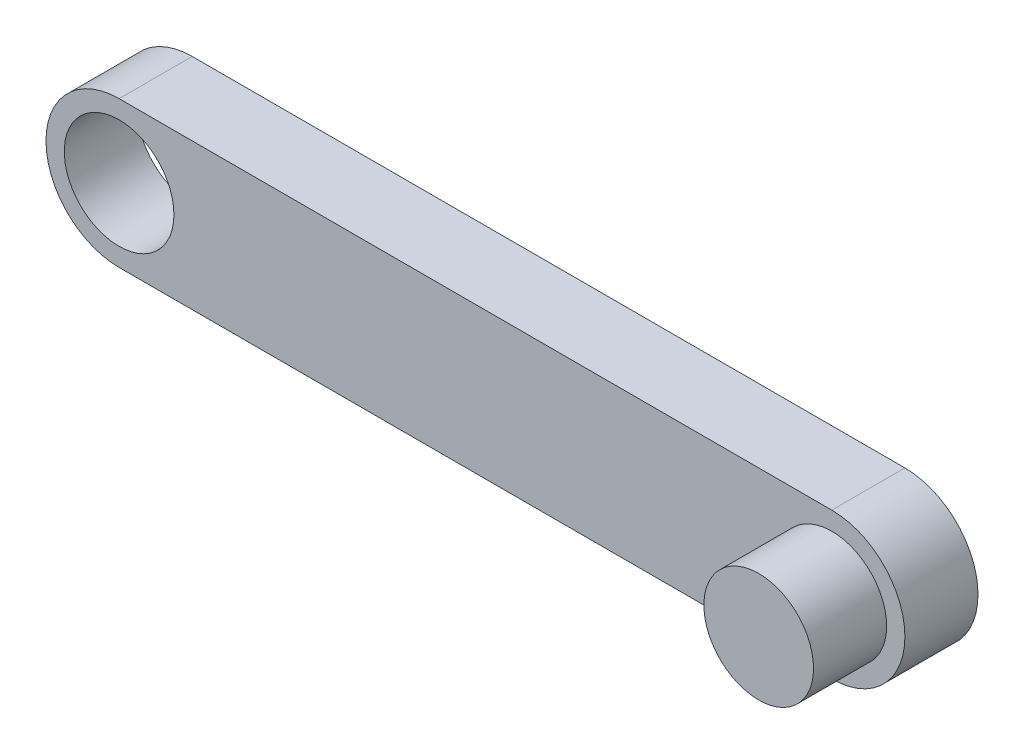
ISO-10303-21;
HEADER;
FILE_DESCRIPTION(('STEP AP214'),'2;1');
FILE_NAME('part.step','',(''),(''),'','','');
FILE_SCHEMA(('AUTOMOTIVE_DESIGN { 1 0 10303 214 1 1 1 1 }'));
ENDSEC;
DATA;
#1=APPLICATION_CONTEXT('core data for automotive mechanical design processes');
#2=APPLICATION_PROTOCOL_DEFINITION('international standard','automotive_design',2000,#1);
#3=PRODUCT_CONTEXT('',#1,'mechanical');
#4=PRODUCT('Part','Part','',(#3));
#5=PRODUCT_RELATED_PRODUCT_CATEGORY('part','',(#4));
#6=PRODUCT_DEFINITION_FORMATION('','',#4);
#7=PRODUCT_DEFINITION_CONTEXT('part definition',#1,'design');
#8=PRODUCT_DEFINITION('design','',#6,#7);
#9=PRODUCT_DEFINITION_SHAPE('','',#8);
#10=(LENGTH_UNIT() NAMED_UNIT(*) SI_UNIT(.MILLI.,.METRE.));
#11=(NAMED_UNIT(*) PLANE_ANGLE_UNIT() SI_UNIT($,.RADIAN.));
#12=(NAMED_UNIT(*) SI_UNIT($,.STERADIAN.) SOLID_ANGLE_UNIT());
#13=UNCERTAINTY_MEASURE_WITH_UNIT(LENGTH_MEASURE(1.E-05),#10,'distance_accuracy_value','');
#14=(GEOMETRIC_REPRESENTATION_CONTEXT(3) GLOBAL_UNCERTAINTY_ASSIGNED_CONTEXT((#13)) GLOBAL_UNIT_ASSIGNED_CONTEXT((#10,
#11,#12)) REPRESENTATION_CONTEXT('',''));
#15=CARTESIAN_POINT('',(0.,0.,0.));
#16=DIRECTION('',(0.,0.,1.));
#17=DIRECTION('',(1.,0.,0.));
#18=AXIS2_PLACEMENT_3D('',#15,#16,#17);
#19=CARTESIAN_POINT('',(-97.5,0.,20.));
#20=DIRECTION('',(0.,0.,1.));
#21=DIRECTION('',(1.,0.,0.));
#22=AXIS2_PLACEMENT_3D('',#19,#20,#21);
#23=PLANE('',#22);
#24=CARTESIAN_POINT('',(-97.5,0.,20.));
#25=DIRECTION('',(0.,0.,1.));
#26=DIRECTION('',(1.,0.,0.));
#27=AXIS2_PLACEMENT_3D('',#24,#25,#26);
#28=CIRCLE('',#27,20.);
#29=CARTESIAN_POINT('',(-97.5,20.,20.));
#30=VERTEX_POINT('',#29);
#31=CARTESIAN_POINT('',(-97.5,-20.,20.));
#32=VERTEX_POINT('',#31);
#33=EDGE_CURVE('E88',#30,#32,#28,.T.);
#34=ORIENTED_EDGE('',*,*,#33,.T.);
#35=DIRECTION('',(1.,0.,0.));
#36=VECTOR('',#35,1.);
#37=CARTESIAN_POINT('',(97.5,-20.,20.));
#38=LINE('',#37,#36);
#39=CARTESIAN_POINT('',(97.5,-20.,20.));
#40=VERTEX_POINT('',#39);
#41=EDGE_CURVE('E83',#32,#40,#38,.T.);
#42=ORIENTED_EDGE('',*,*,#41,.T.);
#43=CARTESIAN_POINT('',(97.5,0.,20.));
#44=DIRECTION('',(0.,0.,1.));
#45=DIRECTION('',(1.,0.,0.));
#46=AXIS2_PLACEMENT_3D('',#43,#44,#45);
#47=CIRCLE('',#46,20.);
#48=CARTESIAN_POINT('',(97.5,20.,20.));
#49=VERTEX_POINT('',#48);
#50=EDGE_CURVE('E86',#40,#49,#47,.T.);
#51=ORIENTED_EDGE('',*,*,#50,.T.);
#52=DIRECTION('',(-1.,0.,0.));
#53=VECTOR('',#52,1.);
#54=CARTESIAN_POINT('',(97.5,20.,20.));
#55=LINE('',#54,#53);
#56=EDGE_CURVE('E53',#49,#30,#55,.T.);
#57=ORIENTED_EDGE('',*,*,#56,.T.);
#58=EDGE_LOOP('',(#34,#42,#51,#57));
#59=FACE_BOUND('',#58,.T.);
#60=CARTESIAN_POINT('',(-97.5,0.,20.));
#61=DIRECTION('',(0.,0.,1.));
#62=DIRECTION('',(1.,0.,0.));
#63=AXIS2_PLACEMENT_3D('',#60,#61,#62);
#64=CIRCLE('',#63,15.);
#65=CARTESIAN_POINT('',(-82.5,0.,20.));
#66=VERTEX_POINT('',#65);
#67=EDGE_CURVE('E114',#66,#66,#64,.T.);
#68=ORIENTED_EDGE('',*,*,#67,.F.);
#69=EDGE_LOOP('',(#68));
#70=FACE_BOUND('',#69,.T.);
#71=CARTESIAN_POINT('',(97.5,0.,20.));
#72=DIRECTION('',(0.,0.,1.));
#73=DIRECTION('',(1.,0.,0.));
#74=AXIS2_PLACEMENT_3D('',#71,#72,#73);
#75=CIRCLE('',#74,15.);
#76=CARTESIAN_POINT('',(112.5,0.,20.));
#77=VERTEX_POINT('',#76);
#78=EDGE_CURVE('E120',#77,#77,#75,.T.);
#79=ORIENTED_EDGE('',*,*,#78,.F.);
#80=EDGE_LOOP('',(#79));
#81=FACE_BOUND('',#80,.T.);
#82=ADVANCED_FACE('F36',(#59,#70,#81),#23,.T.);
#83=CARTESIAN_POINT('',(-97.5,0.,20.));
#84=DIRECTION('',(0.,0.,-1.));
#85=DIRECTION('',(-1.,0.,0.));
#86=AXIS2_PLACEMENT_3D('',#83,#84,#85);
#87=CYLINDRICAL_SURFACE('',#86,20.);
#88=CARTESIAN_POINT('',(-97.5,0.,0.));
#89=DIRECTION('',(0.,0.,1.));
#90=DIRECTION('',(1.,0.,0.));
#91=AXIS2_PLACEMENT_3D('',#88,#89,#90);
#92=CIRCLE('',#91,20.);
#93=CARTESIAN_POINT('',(-97.5,20.,0.));
#94=VERTEX_POINT('',#93);
#95=CARTESIAN_POINT('',(-97.5,-20.,0.));
#96=VERTEX_POINT('',#95);
#97=EDGE_CURVE('E100',#94,#96,#92,.T.);
#98=ORIENTED_EDGE('',*,*,#97,.T.);
#99=DIRECTION('',(0.,0.,-1.));
#100=VECTOR('',#99,1.);
#101=CARTESIAN_POINT('',(-97.5,-20.,20.));
#102=LINE('',#101,#100);
#103=EDGE_CURVE('E11',#32,#96,#102,.T.);
#104=ORIENTED_EDGE('',*,*,#103,.F.);
#105=ORIENTED_EDGE('',*,*,#33,.F.);
#106=DIRECTION('',(0.,0.,-1.));
#107=VECTOR('',#106,1.);
#108=CARTESIAN_POINT('',(-97.5,20.,20.));
#109=LINE('',#108,#107);
#110=EDGE_CURVE('E96',#30,#94,#109,.T.);
#111=ORIENTED_EDGE('',*,*,#110,.T.);
#112=EDGE_LOOP('',(#98,#104,#105,#111));
#113=FACE_BOUND('',#112,.T.);
#114=ADVANCED_FACE('F38',(#113),#87,.T.);
#115=CARTESIAN_POINT('',(97.5,-20.,20.));
#116=DIRECTION('',(0.,1.,0.));
#117=DIRECTION('',(-1.,0.,0.));
#118=AXIS2_PLACEMENT_3D('',#115,#116,#117);
#119=PLANE('',#118);
#120=DIRECTION('',(1.,0.,0.));
#121=VECTOR('',#120,1.);
#122=CARTESIAN_POINT('',(97.5,-20.,0.));
#123=LINE('',#122,#121);
#124=CARTESIAN_POINT('',(97.5,-20.,0.));
#125=VERTEX_POINT('',#124);
#126=EDGE_CURVE('E92',#96,#125,#123,.T.);
#127=ORIENTED_EDGE('',*,*,#126,.T.);
#128=DIRECTION('',(0.,0.,-1.));
#129=VECTOR('',#128,1.);
#130=CARTESIAN_POINT('',(97.5,-20.,20.));
#131=LINE('',#130,#129);
#132=EDGE_CURVE('E45',#40,#125,#131,.T.);
#133=ORIENTED_EDGE('',*,*,#132,.F.);
#134=ORIENTED_EDGE('',*,*,#41,.F.);
#135=ORIENTED_EDGE('',*,*,#103,.T.);
#136=EDGE_LOOP('',(#127,#133,#134,#135));
#137=FACE_BOUND('',#136,.T.);
#138=ADVANCED_FACE('F91',(#137),#119,.F.);
#139=CARTESIAN_POINT('',(97.5,0.,20.));
#140=DIRECTION('',(0.,0.,-1.));
#141=DIRECTION('',(-1.,0.,0.));
#142=AXIS2_PLACEMENT_3D('',#139,#140,#141);
#143=CYLINDRICAL_SURFACE('',#142,20.);
#144=CARTESIAN_POINT('',(97.5,0.,0.));
#145=DIRECTION('',(0.,0.,1.));
#146=DIRECTION('',(1.,0.,0.));
#147=AXIS2_PLACEMENT_3D('',#144,#145,#146);
#148=CIRCLE('',#147,20.);
#149=CARTESIAN_POINT('',(97.5,20.,0.));
#150=VERTEX_POINT('',#149);
#151=EDGE_CURVE('E70',#125,#150,#148,.T.);
#152=ORIENTED_EDGE('',*,*,#151,.T.);
#153=DIRECTION('',(0.,0.,-1.));
#154=VECTOR('',#153,1.);
#155=CARTESIAN_POINT('',(97.5,20.,20.));
#156=LINE('',#155,#154);
#157=EDGE_CURVE('E93',#49,#150,#156,.T.);
#158=ORIENTED_EDGE('',*,*,#157,.F.);
#159=ORIENTED_EDGE('',*,*,#50,.F.);
#160=ORIENTED_EDGE('',*,*,#132,.T.);
#161=EDGE_LOOP('',(#152,#158,#159,#160));
#162=FACE_BOUND('',#161,.T.);
#163=ADVANCED_FACE('F94',(#162),#143,.T.);
#164=CARTESIAN_POINT('',(97.5,20.,20.));
#165=DIRECTION('',(0.,-1.,0.));
#166=DIRECTION('',(1.,0.,0.));
#167=AXIS2_PLACEMENT_3D('',#164,#165,#166);
#168=PLANE('',#167);
#169=DIRECTION('',(-1.,0.,0.));
#170=VECTOR('',#169,1.);
#171=CARTESIAN_POINT('',(97.5,20.,0.));
#172=LINE('',#171,#170);
#173=EDGE_CURVE('E76',#150,#94,#172,.T.);
#174=ORIENTED_EDGE('',*,*,#173,.T.);
#175=ORIENTED_EDGE('',*,*,#110,.F.);
#176=ORIENTED_EDGE('',*,*,#56,.F.);
#177=ORIENTED_EDGE('',*,*,#157,.T.);
#178=EDGE_LOOP('',(#174,#175,#176,#177));
#179=FACE_BOUND('',#178,.T.);
#180=ADVANCED_FACE('F108',(#179),#168,.F.);
#181=CARTESIAN_POINT('',(-97.5,0.,0.));
#182=DIRECTION('',(0.,0.,1.));
#183=DIRECTION('',(1.,0.,0.));
#184=AXIS2_PLACEMENT_3D('',#181,#182,#183);
#185=PLANE('',#184);
#186=CARTESIAN_POINT('',(-97.5,0.,0.));
#187=DIRECTION('',(0.,0.,1.));
#188=DIRECTION('',(1.,0.,0.));
#189=AXIS2_PLACEMENT_3D('',#186,#187,#188);
#190=CIRCLE('',#189,15.);
#191=CARTESIAN_POINT('',(-82.5,0.,0.));
#192=VERTEX_POINT('',#191);
#193=EDGE_CURVE('E103',#192,#192,#190,.T.);
#194=ORIENTED_EDGE('',*,*,#193,.T.);
#195=EDGE_LOOP('',(#194));
#196=FACE_BOUND('',#195,.T.);
#197=ORIENTED_EDGE('',*,*,#97,.F.);
#198=ORIENTED_EDGE('',*,*,#173,.F.);
#199=ORIENTED_EDGE('',*,*,#151,.F.);
#200=ORIENTED_EDGE('',*,*,#126,.F.);
#201=EDGE_LOOP('',(#197,#198,#199,#200));
#202=FACE_BOUND('',#201,.T.);
#203=ADVANCED_FACE('F111',(#196,#202),#185,.F.);
#204=CARTESIAN_POINT('',(-97.5,0.,0.));
#205=DIRECTION('',(0.,0.,1.));
#206=DIRECTION('',(1.,0.,0.));
#207=AXIS2_PLACEMENT_3D('',#204,#205,#206);
#208=CYLINDRICAL_SURFACE('',#207,15.);
#209=ORIENTED_EDGE('',*,*,#193,.F.);
#210=EDGE_LOOP('',(#209));
#211=FACE_BOUND('',#210,.T.);
#212=ORIENTED_EDGE('',*,*,#67,.T.);
#213=EDGE_LOOP('',(#212));
#214=FACE_BOUND('',#213,.T.);
#215=ADVANCED_FACE('F131',(#211,#214),#208,.F.);
#216=CARTESIAN_POINT('',(97.5,0.,40.));
#217=DIRECTION('',(0.,0.,-1.));
#218=DIRECTION('',(-1.,0.,0.));
#219=AXIS2_PLACEMENT_3D('',#216,#217,#218);
#220=CYLINDRICAL_SURFACE('',#219,15.);
#221=CARTESIAN_POINT('',(97.5,0.,40.));
#222=DIRECTION('',(0.,0.,1.));
#223=DIRECTION('',(1.,0.,0.));
#224=AXIS2_PLACEMENT_3D('',#221,#222,#223);
#225=CIRCLE('',#224,15.);
#226=CARTESIAN_POINT('',(112.5,0.,40.));
#227=VERTEX_POINT('',#226);
#228=EDGE_CURVE('E117',#227,#227,#225,.T.);
#229=ORIENTED_EDGE('',*,*,#228,.F.);
#230=EDGE_LOOP('',(#229));
#231=FACE_BOUND('',#230,.T.);
#232=ORIENTED_EDGE('',*,*,#78,.T.);
#233=EDGE_LOOP('',(#232));
#234=FACE_BOUND('',#233,.T.);
#235=ADVANCED_FACE('F128',(#231,#234),#220,.T.);
#236=CARTESIAN_POINT('',(97.5,0.,40.));
#237=DIRECTION('',(0.,0.,1.));
#238=DIRECTION('',(1.,0.,0.));
#239=AXIS2_PLACEMENT_3D('',#236,#237,#238);
#240=PLANE('',#239);
#241=ORIENTED_EDGE('',*,*,#228,.T.);
#242=EDGE_LOOP('',(#241));
#243=FACE_BOUND('',#242,.T.);
#244=ADVANCED_FACE('F126',(#243),#240,.T.);
#245=CLOSED_SHELL('',(#82,#114,#138,#163,#180,#203,#215,#235,#244));
#246=MANIFOLD_SOLID_BREP('B2',#245);
#247=ADVANCED_BREP_SHAPE_REPRESENTATION('',(#18,#246),#14);
#248=SHAPE_DEFINITION_REPRESENTATION(#9,#247);
ENDSEC;
END-ISO-10303-21;
